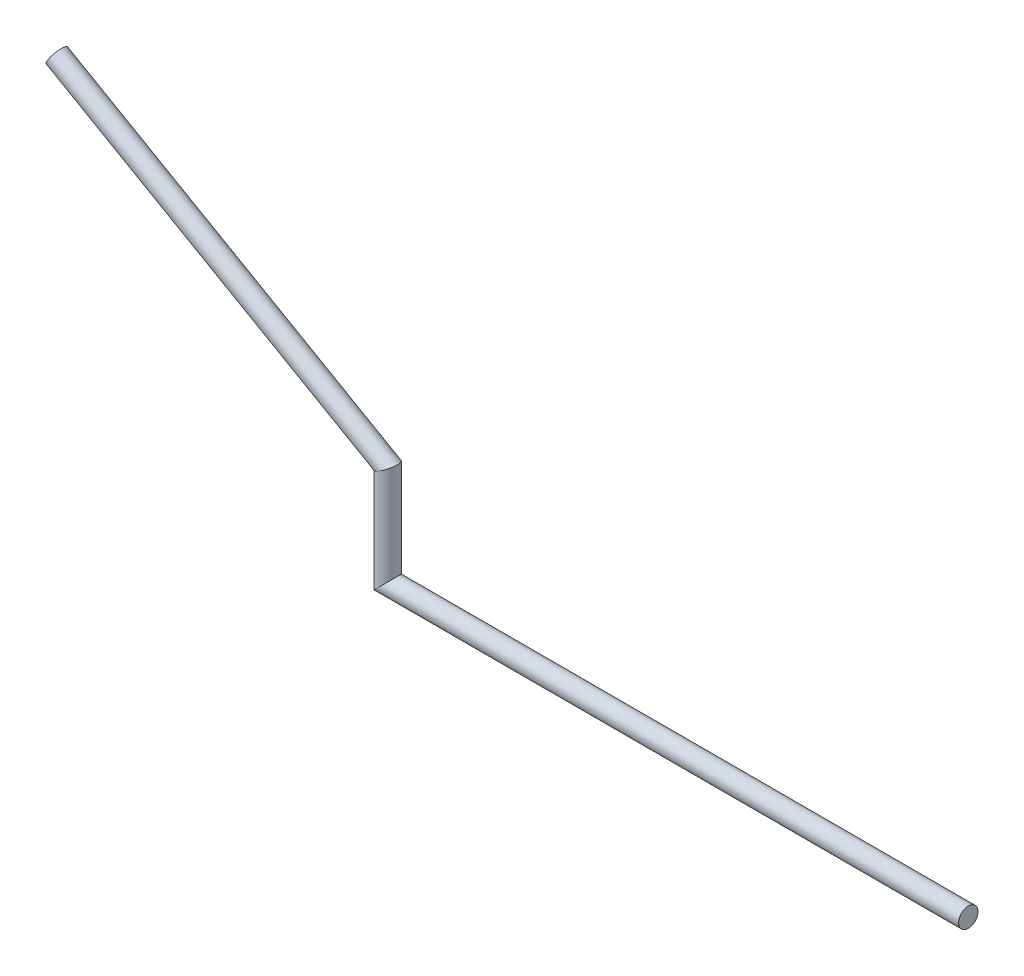
ISO-10303-21;
HEADER;
FILE_DESCRIPTION(('STEP AP214'),'2;1');
FILE_NAME('part.step','',(''),(''),'','','');
FILE_SCHEMA(('AUTOMOTIVE_DESIGN { 1 0 10303 214 1 1 1 1 }'));
ENDSEC;
DATA;
#1=APPLICATION_CONTEXT('core data for automotive mechanical design processes');
#2=APPLICATION_PROTOCOL_DEFINITION('international standard','automotive_design',2000,#1);
#3=PRODUCT_CONTEXT('',#1,'mechanical');
#4=PRODUCT('Part','Part','',(#3));
#5=PRODUCT_RELATED_PRODUCT_CATEGORY('part','',(#4));
#6=PRODUCT_DEFINITION_FORMATION('','',#4);
#7=PRODUCT_DEFINITION_CONTEXT('part definition',#1,'design');
#8=PRODUCT_DEFINITION('design','',#6,#7);
#9=PRODUCT_DEFINITION_SHAPE('','',#8);
#10=(LENGTH_UNIT() NAMED_UNIT(*) SI_UNIT(.MILLI.,.METRE.));
#11=(NAMED_UNIT(*) PLANE_ANGLE_UNIT() SI_UNIT($,.RADIAN.));
#12=(NAMED_UNIT(*) SI_UNIT($,.STERADIAN.) SOLID_ANGLE_UNIT());
#13=UNCERTAINTY_MEASURE_WITH_UNIT(LENGTH_MEASURE(1.E-05),#10,'distance_accuracy_value','');
#14=(GEOMETRIC_REPRESENTATION_CONTEXT(3) GLOBAL_UNCERTAINTY_ASSIGNED_CONTEXT((#13)) GLOBAL_UNIT_ASSIGNED_CONTEXT((#10,
#11,#12)) REPRESENTATION_CONTEXT('',''));
#15=CARTESIAN_POINT('',(0.,0.,0.));
#16=DIRECTION('',(0.,0.,1.));
#17=DIRECTION('',(1.,0.,0.));
#18=AXIS2_PLACEMENT_3D('',#15,#16,#17);
#19=CARTESIAN_POINT('',(-76.2,13.2301065719359,0.));
#20=DIRECTION('',(-0.86737106138401,0.497661975515084,0.));
#21=DIRECTION('',(-0.497661975515084,-0.86737106138401,0.));
#22=AXIS2_PLACEMENT_3D('',#19,#20,#21);
#23=CYLINDRICAL_SURFACE('',#22,1.27);
#24=CARTESIAN_POINT('',(-76.2,13.2301065719359,0.));
#25=DIRECTION('',(-0.501167648838648,0.865350211046107,0.));
#26=DIRECTION('',(0.865350211046107,0.501167648838648,0.));
#27=AXIS2_PLACEMENT_3D('',#24,#25,#26);
#28=ELLIPSE('',#27,1.46761390219657,1.27);
#29=CARTESIAN_POINT('',(-74.93,13.9656271807027,0.));
#30=VERTEX_POINT('',#29);
#31=EDGE_CURVE('E36',#30,#30,#28,.T.);
#32=ORIENTED_EDGE('',*,*,#31,.T.);
#33=EDGE_LOOP('',(#32));
#34=FACE_BOUND('',#33,.T.);
#35=CARTESIAN_POINT('',(-119.643826775587,38.1563943161631,0.));
#36=DIRECTION('',(-0.86737106138401,0.497661975515084,0.));
#37=DIRECTION('',(-0.497661975515084,-0.86737106138401,0.));
#38=AXIS2_PLACEMENT_3D('',#35,#36,#37);
#39=CIRCLE('',#38,1.27);
#40=CARTESIAN_POINT('',(-120.275857484491,37.0548330682054,0.));
#41=VERTEX_POINT('',#40);
#42=EDGE_CURVE('E11',#41,#41,#39,.F.);
#43=ORIENTED_EDGE('',*,*,#42,.T.);
#44=EDGE_LOOP('',(#43));
#45=FACE_BOUND('',#44,.T.);
#46=ADVANCED_FACE('F30',(#34,#45),#23,.T.);
#47=CARTESIAN_POINT('',(-76.2,0.,0.));
#48=DIRECTION('',(0.,1.,0.));
#49=DIRECTION('',(0.,0.,1.));
#50=AXIS2_PLACEMENT_3D('',#47,#48,#49);
#51=CYLINDRICAL_SURFACE('',#50,1.27);
#52=CARTESIAN_POINT('',(-76.2,0.,0.));
#53=DIRECTION('',(-0.707106781186548,0.707106781186547,0.));
#54=DIRECTION('',(0.707106781186547,0.707106781186548,0.));
#55=AXIS2_PLACEMENT_3D('',#52,#53,#54);
#56=ELLIPSE('',#55,1.79605122421383,1.27);
#57=CARTESIAN_POINT('',(-74.93,1.26999999999999,0.));
#58=VERTEX_POINT('',#57);
#59=EDGE_CURVE('E40',#58,#58,#56,.F.);
#60=ORIENTED_EDGE('',*,*,#59,.F.);
#61=EDGE_LOOP('',(#60));
#62=FACE_BOUND('',#61,.T.);
#63=ORIENTED_EDGE('',*,*,#31,.F.);
#64=EDGE_LOOP('',(#63));
#65=FACE_BOUND('',#64,.T.);
#66=ADVANCED_FACE('F59',(#62,#65),#51,.T.);
#67=CARTESIAN_POINT('',(0.,0.,0.));
#68=DIRECTION('',(1.,0.,0.));
#69=DIRECTION('',(0.,0.,-1.));
#70=AXIS2_PLACEMENT_3D('',#67,#68,#69);
#71=PLANE('',#70);
#72=CARTESIAN_POINT('',(0.,0.,0.));
#73=DIRECTION('',(1.,0.,0.));
#74=DIRECTION('',(0.,0.,-1.));
#75=AXIS2_PLACEMENT_3D('',#72,#73,#74);
#76=CIRCLE('',#75,1.27);
#77=CARTESIAN_POINT('',(0.,0.,-1.27));
#78=VERTEX_POINT('',#77);
#79=EDGE_CURVE('E44',#78,#78,#76,.T.);
#80=ORIENTED_EDGE('',*,*,#79,.T.);
#81=EDGE_LOOP('',(#80));
#82=FACE_BOUND('',#81,.T.);
#83=ADVANCED_FACE('F50',(#82),#71,.T.);
#84=CARTESIAN_POINT('',(-79.7921024484277,0.,0.));
#85=DIRECTION('',(1.,0.,0.));
#86=DIRECTION('',(0.,1.,0.));
#87=AXIS2_PLACEMENT_3D('',#84,#85,#86);
#88=CYLINDRICAL_SURFACE('',#87,1.27);
#89=ORIENTED_EDGE('',*,*,#79,.F.);
#90=EDGE_LOOP('',(#89));
#91=FACE_BOUND('',#90,.T.);
#92=ORIENTED_EDGE('',*,*,#59,.T.);
#93=EDGE_LOOP('',(#92));
#94=FACE_BOUND('',#93,.T.);
#95=ADVANCED_FACE('F52',(#91,#94),#88,.T.);
#96=CARTESIAN_POINT('',(-119.643826775587,38.1563943161631,0.));
#97=DIRECTION('',(-0.86737106138401,0.497661975515084,0.));
#98=DIRECTION('',(-0.497661975515084,-0.86737106138401,0.));
#99=AXIS2_PLACEMENT_3D('',#96,#97,#98);
#100=PLANE('',#99);
#101=ORIENTED_EDGE('',*,*,#42,.F.);
#102=EDGE_LOOP('',(#101));
#103=FACE_BOUND('',#102,.T.);
#104=ADVANCED_FACE('F55',(#103),#100,.T.);
#105=CLOSED_SHELL('',(#46,#66,#83,#95,#104));
#106=MANIFOLD_SOLID_BREP('B2',#105);
#107=ADVANCED_BREP_SHAPE_REPRESENTATION('',(#18,#106),#14);
#108=SHAPE_DEFINITION_REPRESENTATION(#9,#107);
ENDSEC;
END-ISO-10303-21;
